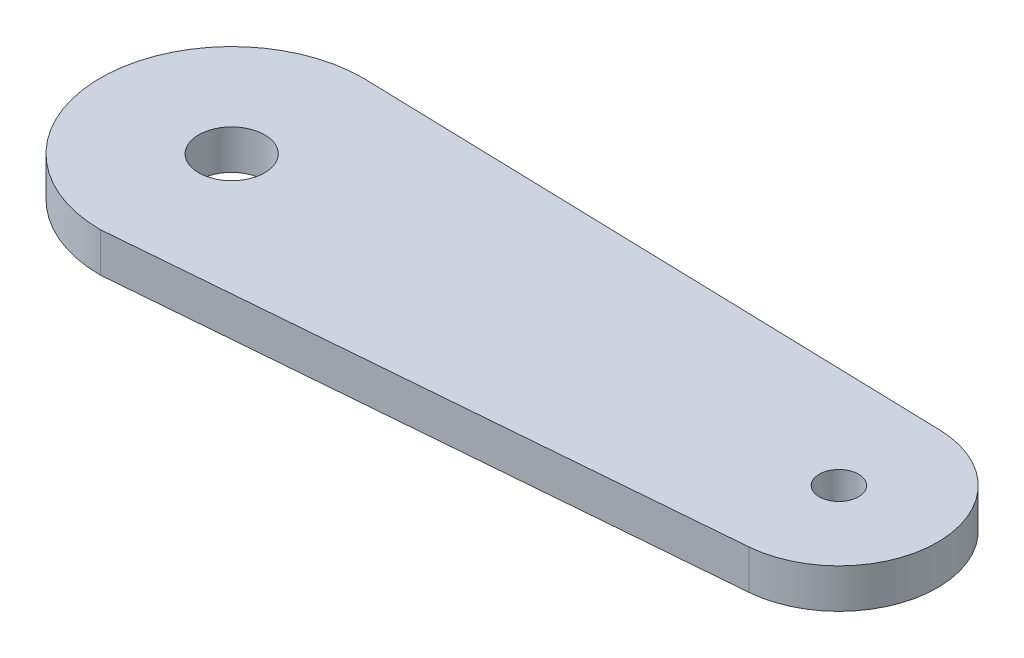
ISO-10303-21;
HEADER;
FILE_DESCRIPTION(('STEP AP214'),'2;1');
FILE_NAME('part.step','',(''),(''),'','','');
FILE_SCHEMA(('AUTOMOTIVE_DESIGN { 1 0 10303 214 1 1 1 1 }'));
ENDSEC;
DATA;
#1=APPLICATION_CONTEXT('core data for automotive mechanical design processes');
#2=APPLICATION_PROTOCOL_DEFINITION('international standard','automotive_design',2000,#1);
#3=PRODUCT_CONTEXT('',#1,'mechanical');
#4=PRODUCT('Part','Part','',(#3));
#5=PRODUCT_RELATED_PRODUCT_CATEGORY('part','',(#4));
#6=PRODUCT_DEFINITION_FORMATION('','',#4);
#7=PRODUCT_DEFINITION_CONTEXT('part definition',#1,'design');
#8=PRODUCT_DEFINITION('design','',#6,#7);
#9=PRODUCT_DEFINITION_SHAPE('','',#8);
#10=(LENGTH_UNIT() NAMED_UNIT(*) SI_UNIT(.MILLI.,.METRE.));
#11=(NAMED_UNIT(*) PLANE_ANGLE_UNIT() SI_UNIT($,.RADIAN.));
#12=(NAMED_UNIT(*) SI_UNIT($,.STERADIAN.) SOLID_ANGLE_UNIT());
#13=UNCERTAINTY_MEASURE_WITH_UNIT(LENGTH_MEASURE(1.E-05),#10,'distance_accuracy_value','');
#14=(GEOMETRIC_REPRESENTATION_CONTEXT(3) GLOBAL_UNCERTAINTY_ASSIGNED_CONTEXT((#13)) GLOBAL_UNIT_ASSIGNED_CONTEXT((#10,
#11,#12)) REPRESENTATION_CONTEXT('',''));
#15=CARTESIAN_POINT('',(0.,0.,0.));
#16=DIRECTION('',(0.,0.,1.));
#17=DIRECTION('',(1.,0.,0.));
#18=AXIS2_PLACEMENT_3D('',#15,#16,#17);
#19=CARTESIAN_POINT('',(0.821566681352623,3.,9.93204097591365));
#20=DIRECTION('',(-0.0824372634712927,0.,-0.996596256059275));
#21=DIRECTION('',(-0.996596256059275,0.,0.0824372634712927));
#22=AXIS2_PLACEMENT_3D('',#19,#20,#21);
#23=PLANE('',#22);
#24=DIRECTION('',(0.996596256059275,0.,-0.0824372634712927));
#25=VECTOR('',#24,1.);
#26=CARTESIAN_POINT('',(0.821566681352623,0.,9.93204097591365));
#27=LINE('',#26,#25);
#28=CARTESIAN_POINT('',(0.,0.,10.));
#29=VERTEX_POINT('',#28);
#30=CARTESIAN_POINT('',(45.6010112062696,0.,6.22793829245028));
#31=VERTEX_POINT('',#30);
#32=EDGE_CURVE('E120',#29,#31,#27,.T.);
#33=ORIENTED_EDGE('',*,*,#32,.T.);
#34=DIRECTION('',(0.,-1.,0.));
#35=VECTOR('',#34,1.);
#36=CARTESIAN_POINT('',(45.6010112062696,3.,6.22793829245028));
#37=LINE('',#36,#35);
#38=CARTESIAN_POINT('',(45.6010112062696,3.,6.22793829245028));
#39=VERTEX_POINT('',#38);
#40=EDGE_CURVE('E13',#39,#31,#37,.T.);
#41=ORIENTED_EDGE('',*,*,#40,.F.);
#42=DIRECTION('',(0.996596256059275,0.,-0.0824372634712927));
#43=VECTOR('',#42,1.);
#44=CARTESIAN_POINT('',(0.821566681352623,3.,9.93204097591365));
#45=LINE('',#44,#43);
#46=CARTESIAN_POINT('',(0.,3.,10.));
#47=VERTEX_POINT('',#46);
#48=EDGE_CURVE('E101',#47,#39,#45,.T.);
#49=ORIENTED_EDGE('',*,*,#48,.F.);
#50=DIRECTION('',(0.,-1.,0.));
#51=VECTOR('',#50,1.);
#52=CARTESIAN_POINT('',(0.,3.,10.));
#53=LINE('',#52,#51);
#54=EDGE_CURVE('E116',#47,#29,#53,.T.);
#55=ORIENTED_EDGE('',*,*,#54,.T.);
#56=EDGE_LOOP('',(#33,#41,#49,#55));
#57=FACE_BOUND('',#56,.T.);
#58=ADVANCED_FACE('F53',(#57),#23,.F.);
#59=CARTESIAN_POINT('',(44.9827317302349,3.,-1.24653362799429));
#60=DIRECTION('',(0.,-1.,0.));
#61=DIRECTION('',(0.,0.,-1.));
#62=AXIS2_PLACEMENT_3D('',#59,#60,#61);
#63=CYLINDRICAL_SURFACE('',#62,7.50000000000001);
#64=CARTESIAN_POINT('',(44.9827317302349,0.,-1.24653362799429));
#65=DIRECTION('',(0.,1.,0.));
#66=DIRECTION('',(0.,0.,1.));
#67=AXIS2_PLACEMENT_3D('',#64,#65,#66);
#68=CIRCLE('',#67,7.50000000000001);
#69=CARTESIAN_POINT('',(45.1911593044558,0.,-8.74363693169128));
#70=VERTEX_POINT('',#69);
#71=EDGE_CURVE('E107',#31,#70,#68,.T.);
#72=ORIENTED_EDGE('',*,*,#71,.T.);
#73=DIRECTION('',(0.,-1.,0.));
#74=VECTOR('',#73,1.);
#75=CARTESIAN_POINT('',(45.1911593044558,3.,-8.74363693169128));
#76=LINE('',#75,#74);
#77=CARTESIAN_POINT('',(45.1911593044558,3.,-8.74363693169128));
#78=VERTEX_POINT('',#77);
#79=EDGE_CURVE('E62',#78,#70,#76,.T.);
#80=ORIENTED_EDGE('',*,*,#79,.F.);
#81=CARTESIAN_POINT('',(44.9827317302349,3.,-1.24653362799429));
#82=DIRECTION('',(0.,1.,0.));
#83=DIRECTION('',(0.,0.,1.));
#84=AXIS2_PLACEMENT_3D('',#81,#82,#83);
#85=CIRCLE('',#84,7.50000000000001);
#86=EDGE_CURVE('E96',#39,#78,#85,.T.);
#87=ORIENTED_EDGE('',*,*,#86,.F.);
#88=ORIENTED_EDGE('',*,*,#40,.T.);
#89=EDGE_LOOP('',(#72,#80,#87,#88));
#90=FACE_BOUND('',#89,.T.);
#91=ADVANCED_FACE('F106',(#90),#63,.T.);
#92=CARTESIAN_POINT('',(0.277796098715276,3.,-9.99227696823189));
#93=DIRECTION('',(0.0277903432294599,0.,-0.999613773826266));
#94=DIRECTION('',(-0.999613773826266,0.,-0.0277903432294599));
#95=AXIS2_PLACEMENT_3D('',#92,#93,#94);
#96=PLANE('',#95);
#97=DIRECTION('',(0.999613773826266,0.,0.0277903432294599));
#98=VECTOR('',#97,1.);
#99=CARTESIAN_POINT('',(0.277796098715276,0.,-9.99227696823189));
#100=LINE('',#99,#98);
#101=CARTESIAN_POINT('',(0.,0.,-10.));
#102=VERTEX_POINT('',#101);
#103=EDGE_CURVE('E127',#102,#70,#100,.T.);
#104=ORIENTED_EDGE('',*,*,#103,.F.);
#105=DIRECTION('',(0.,-1.,0.));
#106=VECTOR('',#105,1.);
#107=CARTESIAN_POINT('',(0.,3.,-10.));
#108=LINE('',#107,#106);
#109=CARTESIAN_POINT('',(0.,3.,-10.));
#110=VERTEX_POINT('',#109);
#111=EDGE_CURVE('E86',#110,#102,#108,.T.);
#112=ORIENTED_EDGE('',*,*,#111,.F.);
#113=DIRECTION('',(0.999613773826266,0.,0.0277903432294599));
#114=VECTOR('',#113,1.);
#115=CARTESIAN_POINT('',(0.277796098715276,3.,-9.99227696823189));
#116=LINE('',#115,#114);
#117=EDGE_CURVE('E99',#110,#78,#116,.T.);
#118=ORIENTED_EDGE('',*,*,#117,.T.);
#119=ORIENTED_EDGE('',*,*,#79,.T.);
#120=EDGE_LOOP('',(#104,#112,#118,#119));
#121=FACE_BOUND('',#120,.T.);
#122=ADVANCED_FACE('F112',(#121),#96,.T.);
#123=CARTESIAN_POINT('',(0.,3.,0.));
#124=DIRECTION('',(0.,-1.,0.));
#125=DIRECTION('',(0.,0.,-1.));
#126=AXIS2_PLACEMENT_3D('',#123,#124,#125);
#127=CYLINDRICAL_SURFACE('',#126,10.);
#128=CARTESIAN_POINT('',(0.,0.,0.));
#129=DIRECTION('',(0.,1.,0.));
#130=DIRECTION('',(0.,0.,1.));
#131=AXIS2_PLACEMENT_3D('',#128,#129,#130);
#132=CIRCLE('',#131,10.);
#133=EDGE_CURVE('E89',#102,#29,#132,.T.);
#134=ORIENTED_EDGE('',*,*,#133,.T.);
#135=ORIENTED_EDGE('',*,*,#54,.F.);
#136=CARTESIAN_POINT('',(0.,3.,0.));
#137=DIRECTION('',(0.,1.,0.));
#138=DIRECTION('',(0.,0.,1.));
#139=AXIS2_PLACEMENT_3D('',#136,#137,#138);
#140=CIRCLE('',#139,10.);
#141=EDGE_CURVE('E70',#110,#47,#140,.T.);
#142=ORIENTED_EDGE('',*,*,#141,.F.);
#143=ORIENTED_EDGE('',*,*,#111,.T.);
#144=EDGE_LOOP('',(#134,#135,#142,#143));
#145=FACE_BOUND('',#144,.T.);
#146=ADVANCED_FACE('F150',(#145),#127,.T.);
#147=CARTESIAN_POINT('',(0.,3.,0.));
#148=DIRECTION('',(0.,1.,0.));
#149=DIRECTION('',(0.,0.,1.));
#150=AXIS2_PLACEMENT_3D('',#147,#148,#149);
#151=PLANE('',#150);
#152=CARTESIAN_POINT('',(0.,3.,0.));
#153=DIRECTION('',(0.,1.,0.));
#154=DIRECTION('',(0.,0.,1.));
#155=AXIS2_PLACEMENT_3D('',#152,#153,#154);
#156=CIRCLE('',#155,2.51);
#157=CARTESIAN_POINT('',(0.,3.,2.51));
#158=VERTEX_POINT('',#157);
#159=EDGE_CURVE('E202',#158,#158,#156,.T.);
#160=ORIENTED_EDGE('',*,*,#159,.F.);
#161=EDGE_LOOP('',(#160));
#162=FACE_BOUND('',#161,.T.);
#163=CARTESIAN_POINT('',(44.9827317302349,3.,-1.24653362799429));
#164=DIRECTION('',(0.,1.,0.));
#165=DIRECTION('',(0.,0.,1.));
#166=AXIS2_PLACEMENT_3D('',#163,#164,#165);
#167=CIRCLE('',#166,1.49500000000001);
#168=CARTESIAN_POINT('',(44.9827317302349,3.,0.248466372005717));
#169=VERTEX_POINT('',#168);
#170=EDGE_CURVE('E210',#169,#169,#167,.T.);
#171=ORIENTED_EDGE('',*,*,#170,.F.);
#172=EDGE_LOOP('',(#171));
#173=FACE_BOUND('',#172,.T.);
#174=ORIENTED_EDGE('',*,*,#48,.T.);
#175=ORIENTED_EDGE('',*,*,#86,.T.);
#176=ORIENTED_EDGE('',*,*,#117,.F.);
#177=ORIENTED_EDGE('',*,*,#141,.T.);
#178=EDGE_LOOP('',(#174,#175,#176,#177));
#179=FACE_BOUND('',#178,.T.);
#180=ADVANCED_FACE('F97',(#162,#173,#179),#151,.T.);
#181=CARTESIAN_POINT('',(0.,0.,0.));
#182=DIRECTION('',(0.,1.,0.));
#183=DIRECTION('',(0.,0.,1.));
#184=AXIS2_PLACEMENT_3D('',#181,#182,#183);
#185=PLANE('',#184);
#186=CARTESIAN_POINT('',(0.,0.,0.));
#187=DIRECTION('',(0.,1.,0.));
#188=DIRECTION('',(0.,0.,1.));
#189=AXIS2_PLACEMENT_3D('',#186,#187,#188);
#190=CIRCLE('',#189,2.51);
#191=CARTESIAN_POINT('',(0.,0.,2.51));
#192=VERTEX_POINT('',#191);
#193=EDGE_CURVE('E124',#192,#192,#190,.F.);
#194=ORIENTED_EDGE('',*,*,#193,.F.);
#195=EDGE_LOOP('',(#194));
#196=FACE_BOUND('',#195,.T.);
#197=CARTESIAN_POINT('',(44.9827317302349,0.,-1.24653362799429));
#198=DIRECTION('',(0.,1.,0.));
#199=DIRECTION('',(0.,0.,1.));
#200=AXIS2_PLACEMENT_3D('',#197,#198,#199);
#201=CIRCLE('',#200,1.49500000000001);
#202=CARTESIAN_POINT('',(44.9827317302349,0.,0.248466372005717));
#203=VERTEX_POINT('',#202);
#204=EDGE_CURVE('E207',#203,#203,#201,.F.);
#205=ORIENTED_EDGE('',*,*,#204,.F.);
#206=EDGE_LOOP('',(#205));
#207=FACE_BOUND('',#206,.T.);
#208=ORIENTED_EDGE('',*,*,#32,.F.);
#209=ORIENTED_EDGE('',*,*,#133,.F.);
#210=ORIENTED_EDGE('',*,*,#103,.T.);
#211=ORIENTED_EDGE('',*,*,#71,.F.);
#212=EDGE_LOOP('',(#208,#209,#210,#211));
#213=FACE_BOUND('',#212,.T.);
#214=ADVANCED_FACE('F138',(#196,#207,#213),#185,.F.);
#215=CARTESIAN_POINT('',(44.9827317302349,-0.00100000000000013,-1.24653362799429));
#216=DIRECTION('',(0.,1.,0.));
#217=DIRECTION('',(0.,0.,1.));
#218=AXIS2_PLACEMENT_3D('',#215,#216,#217);
#219=CYLINDRICAL_SURFACE('',#218,1.49500000000001);
#220=CARTESIAN_POINT('',(44.9827317302349,3.,0.248466372005717));
#221=CARTESIAN_POINT('',(44.9827317302349,2.96875,0.248466372005717));
#222=CARTESIAN_POINT('',(44.9827317302349,2.9375,0.248466372005717));
#223=CARTESIAN_POINT('',(44.9827317302349,2.875,0.248466372005717));
#224=CARTESIAN_POINT('',(44.9827317302349,2.84375,0.248466372005717));
#225=CARTESIAN_POINT('',(44.9827317302349,2.78125,0.248466372005717));
#226=CARTESIAN_POINT('',(44.9827317302349,2.75,0.248466372005717));
#227=CARTESIAN_POINT('',(44.9827317302349,2.6875,0.248466372005717));
#228=CARTESIAN_POINT('',(44.9827317302349,2.65625,0.248466372005717));
#229=CARTESIAN_POINT('',(44.9827317302349,2.59375,0.248466372005717));
#230=CARTESIAN_POINT('',(44.9827317302349,2.5625,0.248466372005717));
#231=CARTESIAN_POINT('',(44.9827317302349,2.5,0.248466372005717));
#232=CARTESIAN_POINT('',(44.9827317302349,2.46875,0.248466372005717));
#233=CARTESIAN_POINT('',(44.9827317302349,2.40625,0.248466372005717));
#234=CARTESIAN_POINT('',(44.9827317302349,2.375,0.248466372005717));
#235=CARTESIAN_POINT('',(44.9827317302349,2.3125,0.248466372005717));
#236=CARTESIAN_POINT('',(44.9827317302349,2.28125,0.248466372005717));
#237=CARTESIAN_POINT('',(44.9827317302349,2.21875,0.248466372005717));
#238=CARTESIAN_POINT('',(44.9827317302349,2.1875,0.248466372005717));
#239=CARTESIAN_POINT('',(44.9827317302349,2.125,0.248466372005717));
#240=CARTESIAN_POINT('',(44.9827317302349,2.09375,0.248466372005717));
#241=CARTESIAN_POINT('',(44.9827317302349,2.03125,0.248466372005717));
#242=CARTESIAN_POINT('',(44.9827317302349,2.,0.248466372005717));
#243=CARTESIAN_POINT('',(44.9827317302349,1.9375,0.248466372005717));
#244=CARTESIAN_POINT('',(44.9827317302349,1.90625,0.248466372005717));
#245=CARTESIAN_POINT('',(44.9827317302349,1.84375,0.248466372005717));
#246=CARTESIAN_POINT('',(44.9827317302349,1.8125,0.248466372005717));
#247=CARTESIAN_POINT('',(44.9827317302349,1.75,0.248466372005717));
#248=CARTESIAN_POINT('',(44.9827317302349,1.71875,0.248466372005717));
#249=CARTESIAN_POINT('',(44.9827317302349,1.65625,0.248466372005717));
#250=CARTESIAN_POINT('',(44.9827317302349,1.625,0.248466372005717));
#251=CARTESIAN_POINT('',(44.9827317302349,1.5625,0.248466372005717));
#252=CARTESIAN_POINT('',(44.9827317302349,1.53125,0.248466372005717));
#253=CARTESIAN_POINT('',(44.9827317302349,1.46875,0.248466372005717));
#254=CARTESIAN_POINT('',(44.9827317302349,1.4375,0.248466372005717));
#255=CARTESIAN_POINT('',(44.9827317302349,1.375,0.248466372005717));
#256=CARTESIAN_POINT('',(44.9827317302349,1.34375,0.248466372005717));
#257=CARTESIAN_POINT('',(44.9827317302349,1.28125,0.248466372005717));
#258=CARTESIAN_POINT('',(44.9827317302349,1.25,0.248466372005717));
#259=CARTESIAN_POINT('',(44.9827317302349,1.1875,0.248466372005717));
#260=CARTESIAN_POINT('',(44.9827317302349,1.15625,0.248466372005717));
#261=CARTESIAN_POINT('',(44.9827317302349,1.09375,0.248466372005717));
#262=CARTESIAN_POINT('',(44.9827317302349,1.0625,0.248466372005717));
#263=CARTESIAN_POINT('',(44.9827317302349,1.,0.248466372005717));
#264=CARTESIAN_POINT('',(44.9827317302349,0.96875,0.248466372005717));
#265=CARTESIAN_POINT('',(44.9827317302349,0.90625,0.248466372005717));
#266=CARTESIAN_POINT('',(44.9827317302349,0.875,0.248466372005717));
#267=CARTESIAN_POINT('',(44.9827317302349,0.8125,0.248466372005717));
#268=CARTESIAN_POINT('',(44.9827317302349,0.78125,0.248466372005717));
#269=CARTESIAN_POINT('',(44.9827317302349,0.71875,0.248466372005717));
#270=CARTESIAN_POINT('',(44.9827317302349,0.6875,0.248466372005717));
#271=CARTESIAN_POINT('',(44.9827317302349,0.625,0.248466372005717));
#272=CARTESIAN_POINT('',(44.9827317302349,0.59375,0.248466372005717));
#273=CARTESIAN_POINT('',(44.9827317302349,0.53125,0.248466372005717));
#274=CARTESIAN_POINT('',(44.9827317302349,0.5,0.248466372005717));
#275=CARTESIAN_POINT('',(44.9827317302349,0.4375,0.248466372005717));
#276=CARTESIAN_POINT('',(44.9827317302349,0.40625,0.248466372005717));
#277=CARTESIAN_POINT('',(44.9827317302349,0.34375,0.248466372005717));
#278=CARTESIAN_POINT('',(44.9827317302349,0.3125,0.248466372005717));
#279=CARTESIAN_POINT('',(44.9827317302349,0.25,0.248466372005717));
#280=CARTESIAN_POINT('',(44.9827317302349,0.21875,0.248466372005717));
#281=CARTESIAN_POINT('',(44.9827317302349,0.15625,0.248466372005717));
#282=CARTESIAN_POINT('',(44.9827317302349,0.125,0.248466372005717));
#283=CARTESIAN_POINT('',(44.9827317302349,0.0625000000000001,0.248466372005717));
#284=CARTESIAN_POINT('',(44.9827317302349,0.0312500000000001,0.248466372005717));
#285=CARTESIAN_POINT('',(44.9827317302349,0.,0.248466372005717));
#286=B_SPLINE_CURVE_WITH_KNOTS('',3,(#220,#221,#222,#223,#224,#225,#226,#227,#228,#229,#230,
#231,#232,#233,#234,#235,#236,#237,#238,#239,#240,#241,#242,#243,#244,#245,#246,#247,#248,#249,
#250,#251,#252,#253,#254,#255,#256,#257,#258,#259,#260,#261,#262,#263,#264,#265,#266,#267,#268,
#269,#270,#271,#272,#273,#274,#275,#276,#277,#278,#279,#280,#281,#282,#283,#284,#285),
.UNSPECIFIED.,.F.,.F.,(4,2,2,2,2,2,2,2,2,2,2,2,2,2,2,2,2,2,2,2,2,2,2,2,2,2,2,2,2,2,2,2,4),(0.,
0.0937500000000001,0.1875,0.28125,0.375,0.46875,0.5625,0.65625,0.75,0.84375,0.9375,1.03125,
1.125,1.21875,1.3125,1.40625,1.5,1.59375,1.6875,1.78125,1.875,1.96875,2.0625,2.15625,2.25,
2.34375,2.4375,2.53125,2.625,2.71875,2.8125,2.90625,3.),.UNSPECIFIED.);
#287=EDGE_CURVE('BSEAM140',#169,#203,#286,.T.);
#288=ORIENTED_EDGE('',*,*,#170,.T.);
#289=ORIENTED_EDGE('',*,*,#204,.T.);
#290=ORIENTED_EDGE('',*,*,#287,.T.);
#291=ORIENTED_EDGE('',*,*,#287,.F.);
#292=EDGE_LOOP('',(#288,#290,#289,#291));
#293=FACE_BOUND('',#292,.T.);
#294=ADVANCED_FACE('F140',(#293),#219,.F.);
#295=CARTESIAN_POINT('',(0.,-0.00100000000000013,0.));
#296=DIRECTION('',(0.,1.,0.));
#297=DIRECTION('',(0.,0.,1.));
#298=AXIS2_PLACEMENT_3D('',#295,#296,#297);
#299=CYLINDRICAL_SURFACE('',#298,2.51);
#300=CARTESIAN_POINT('',(0.,3.,2.51));
#301=CARTESIAN_POINT('',(0.,2.96875,2.51));
#302=CARTESIAN_POINT('',(0.,2.9375,2.51));
#303=CARTESIAN_POINT('',(0.,2.875,2.51));
#304=CARTESIAN_POINT('',(0.,2.84375,2.51));
#305=CARTESIAN_POINT('',(0.,2.78125,2.51));
#306=CARTESIAN_POINT('',(0.,2.75,2.51));
#307=CARTESIAN_POINT('',(0.,2.6875,2.51));
#308=CARTESIAN_POINT('',(0.,2.65625,2.51));
#309=CARTESIAN_POINT('',(0.,2.59375,2.51));
#310=CARTESIAN_POINT('',(0.,2.5625,2.51));
#311=CARTESIAN_POINT('',(0.,2.5,2.51));
#312=CARTESIAN_POINT('',(0.,2.46875,2.51));
#313=CARTESIAN_POINT('',(0.,2.40625,2.51));
#314=CARTESIAN_POINT('',(0.,2.375,2.51));
#315=CARTESIAN_POINT('',(0.,2.3125,2.51));
#316=CARTESIAN_POINT('',(0.,2.28125,2.51));
#317=CARTESIAN_POINT('',(0.,2.21875,2.51));
#318=CARTESIAN_POINT('',(0.,2.1875,2.51));
#319=CARTESIAN_POINT('',(0.,2.125,2.51));
#320=CARTESIAN_POINT('',(0.,2.09375,2.51));
#321=CARTESIAN_POINT('',(0.,2.03125,2.51));
#322=CARTESIAN_POINT('',(0.,2.,2.51));
#323=CARTESIAN_POINT('',(0.,1.9375,2.51));
#324=CARTESIAN_POINT('',(0.,1.90625,2.51));
#325=CARTESIAN_POINT('',(0.,1.84375,2.51));
#326=CARTESIAN_POINT('',(0.,1.8125,2.51));
#327=CARTESIAN_POINT('',(0.,1.75,2.51));
#328=CARTESIAN_POINT('',(0.,1.71875,2.51));
#329=CARTESIAN_POINT('',(0.,1.65625,2.51));
#330=CARTESIAN_POINT('',(0.,1.625,2.51));
#331=CARTESIAN_POINT('',(0.,1.5625,2.51));
#332=CARTESIAN_POINT('',(0.,1.53125,2.51));
#333=CARTESIAN_POINT('',(0.,1.46875,2.51));
#334=CARTESIAN_POINT('',(0.,1.4375,2.51));
#335=CARTESIAN_POINT('',(0.,1.375,2.51));
#336=CARTESIAN_POINT('',(0.,1.34375,2.51));
#337=CARTESIAN_POINT('',(0.,1.28125,2.51));
#338=CARTESIAN_POINT('',(0.,1.25,2.51));
#339=CARTESIAN_POINT('',(0.,1.1875,2.51));
#340=CARTESIAN_POINT('',(0.,1.15625,2.51));
#341=CARTESIAN_POINT('',(0.,1.09375,2.51));
#342=CARTESIAN_POINT('',(0.,1.0625,2.51));
#343=CARTESIAN_POINT('',(0.,1.,2.51));
#344=CARTESIAN_POINT('',(0.,0.96875,2.51));
#345=CARTESIAN_POINT('',(0.,0.90625,2.51));
#346=CARTESIAN_POINT('',(0.,0.875,2.51));
#347=CARTESIAN_POINT('',(0.,0.8125,2.51));
#348=CARTESIAN_POINT('',(0.,0.78125,2.51));
#349=CARTESIAN_POINT('',(0.,0.71875,2.51));
#350=CARTESIAN_POINT('',(0.,0.6875,2.51));
#351=CARTESIAN_POINT('',(0.,0.625,2.51));
#352=CARTESIAN_POINT('',(0.,0.59375,2.51));
#353=CARTESIAN_POINT('',(0.,0.53125,2.51));
#354=CARTESIAN_POINT('',(0.,0.5,2.51));
#355=CARTESIAN_POINT('',(0.,0.4375,2.51));
#356=CARTESIAN_POINT('',(0.,0.40625,2.51));
#357=CARTESIAN_POINT('',(0.,0.34375,2.51));
#358=CARTESIAN_POINT('',(0.,0.3125,2.51));
#359=CARTESIAN_POINT('',(0.,0.25,2.51));
#360=CARTESIAN_POINT('',(0.,0.21875,2.51));
#361=CARTESIAN_POINT('',(0.,0.15625,2.51));
#362=CARTESIAN_POINT('',(0.,0.125,2.51));
#363=CARTESIAN_POINT('',(0.,0.0625000000000001,2.51));
#364=CARTESIAN_POINT('',(0.,0.0312500000000001,2.51));
#365=CARTESIAN_POINT('',(0.,0.,2.51));
#366=B_SPLINE_CURVE_WITH_KNOTS('',3,(#300,#301,#302,#303,#304,#305,#306,#307,#308,#309,#310,
#311,#312,#313,#314,#315,#316,#317,#318,#319,#320,#321,#322,#323,#324,#325,#326,#327,#328,#329,
#330,#331,#332,#333,#334,#335,#336,#337,#338,#339,#340,#341,#342,#343,#344,#345,#346,#347,#348,
#349,#350,#351,#352,#353,#354,#355,#356,#357,#358,#359,#360,#361,#362,#363,#364,#365),
.UNSPECIFIED.,.F.,.F.,(4,2,2,2,2,2,2,2,2,2,2,2,2,2,2,2,2,2,2,2,2,2,2,2,2,2,2,2,2,2,2,2,4),(0.,
0.0937500000000001,0.1875,0.28125,0.375,0.46875,0.5625,0.65625,0.75,0.84375,0.9375,1.03125,
1.125,1.21875,1.3125,1.40625,1.5,1.59375,1.6875,1.78125,1.875,1.96875,2.0625,2.15625,2.25,
2.34375,2.4375,2.53125,2.625,2.71875,2.8125,2.90625,3.),.UNSPECIFIED.);
#367=EDGE_CURVE('BSEAM147',#158,#192,#366,.T.);
#368=ORIENTED_EDGE('',*,*,#159,.T.);
#369=ORIENTED_EDGE('',*,*,#193,.T.);
#370=ORIENTED_EDGE('',*,*,#367,.T.);
#371=ORIENTED_EDGE('',*,*,#367,.F.);
#372=EDGE_LOOP('',(#368,#370,#369,#371));
#373=FACE_BOUND('',#372,.T.);
#374=ADVANCED_FACE('F147',(#373),#299,.F.);
#375=CLOSED_SHELL('',(#58,#91,#122,#146,#180,#214,#294,#374));
#376=MANIFOLD_SOLID_BREP('B2',#375);
#377=ADVANCED_BREP_SHAPE_REPRESENTATION('',(#18,#376),#14);
#378=SHAPE_DEFINITION_REPRESENTATION(#9,#377);
ENDSEC;
END-ISO-10303-21;
